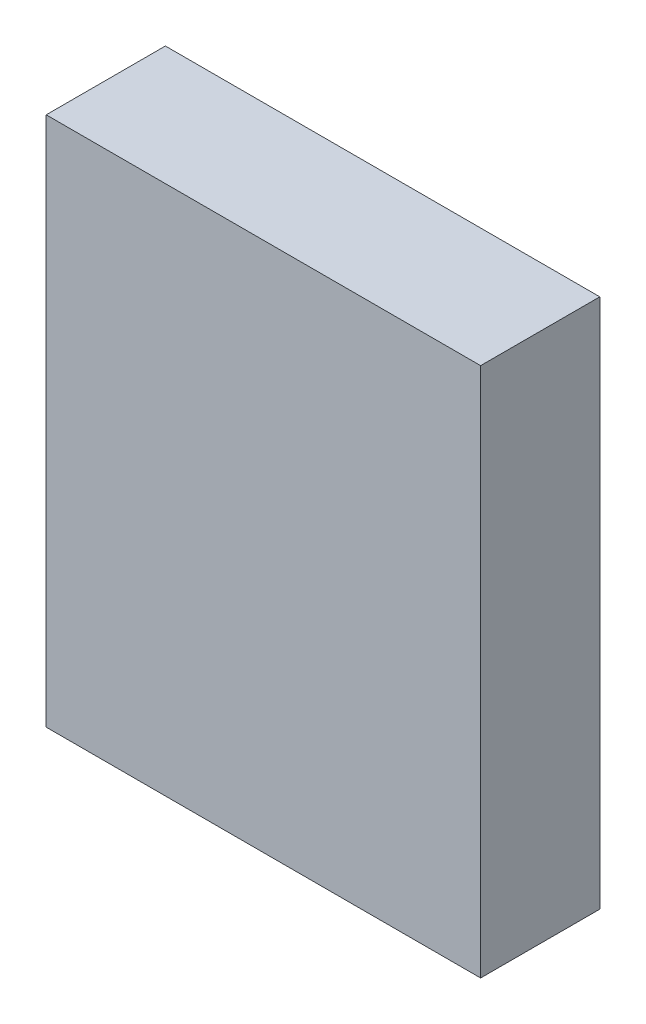
ISO-10303-21;
HEADER;
FILE_DESCRIPTION(('STEP AP214'),'2;1');
FILE_NAME('part.step','',(''),(''),'','','');
FILE_SCHEMA(('AUTOMOTIVE_DESIGN { 1 0 10303 214 1 1 1 1 }'));
ENDSEC;
DATA;
#1=APPLICATION_CONTEXT('core data for automotive mechanical design processes');
#2=APPLICATION_PROTOCOL_DEFINITION('international standard','automotive_design',2000,#1);
#3=PRODUCT_CONTEXT('',#1,'mechanical');
#4=PRODUCT('Part','Part','',(#3));
#5=PRODUCT_RELATED_PRODUCT_CATEGORY('part','',(#4));
#6=PRODUCT_DEFINITION_FORMATION('','',#4);
#7=PRODUCT_DEFINITION_CONTEXT('part definition',#1,'design');
#8=PRODUCT_DEFINITION('design','',#6,#7);
#9=PRODUCT_DEFINITION_SHAPE('','',#8);
#10=(LENGTH_UNIT() NAMED_UNIT(*) SI_UNIT(.MILLI.,.METRE.));
#11=(NAMED_UNIT(*) PLANE_ANGLE_UNIT() SI_UNIT($,.RADIAN.));
#12=(NAMED_UNIT(*) SI_UNIT($,.STERADIAN.) SOLID_ANGLE_UNIT());
#13=UNCERTAINTY_MEASURE_WITH_UNIT(LENGTH_MEASURE(1.E-05),#10,'distance_accuracy_value','');
#14=(GEOMETRIC_REPRESENTATION_CONTEXT(3) GLOBAL_UNCERTAINTY_ASSIGNED_CONTEXT((#13)) GLOBAL_UNIT_ASSIGNED_CONTEXT((#10,
#11,#12)) REPRESENTATION_CONTEXT('',''));
#15=CARTESIAN_POINT('',(0.,0.,0.));
#16=DIRECTION('',(0.,0.,1.));
#17=DIRECTION('',(1.,0.,0.));
#18=AXIS2_PLACEMENT_3D('',#15,#16,#17);
#19=CARTESIAN_POINT('',(206.525,16.17525340094,-37.12183441299));
#20=DIRECTION('',(0.,0.,-1.));
#21=DIRECTION('',(-1.,0.,0.));
#22=AXIS2_PLACEMENT_3D('',#19,#20,#21);
#23=PLANE('',#22);
#24=DIRECTION('',(-1.,9.309009259641E-13,0.));
#25=VECTOR('',#24,1.);
#26=CARTESIAN_POINT('',(206.525,18.58626473742,-37.12183441299));
#27=LINE('',#26,#25);
#28=CARTESIAN_POINT('',(208.5,18.5862647374195,-37.12183441299));
#29=VERTEX_POINT('',#28);
#30=CARTESIAN_POINT('',(204.55,18.5862647374205,-37.12183441299));
#31=VERTEX_POINT('',#30);
#32=EDGE_CURVE('E20',#29,#31,#27,.T.);
#33=ORIENTED_EDGE('',*,*,#32,.F.);
#34=DIRECTION('',(0.,1.,0.));
#35=VECTOR('',#34,1.);
#36=CARTESIAN_POINT('',(208.5,-54.,-37.12183441299));
#37=LINE('',#36,#35);
#38=CARTESIAN_POINT('',(208.5,13.76424206447,-37.12183441299));
#39=VERTEX_POINT('',#38);
#40=EDGE_CURVE('E80',#39,#29,#37,.T.);
#41=ORIENTED_EDGE('',*,*,#40,.F.);
#42=DIRECTION('',(1.,0.,0.));
#43=VECTOR('',#42,1.);
#44=CARTESIAN_POINT('',(206.525,13.76424206447,-37.12183441299));
#45=LINE('',#44,#43);
#46=CARTESIAN_POINT('',(204.55,13.76424206447,-37.12183441299));
#47=VERTEX_POINT('',#46);
#48=EDGE_CURVE('E55',#39,#47,#45,.F.);
#49=ORIENTED_EDGE('',*,*,#48,.T.);
#50=DIRECTION('',(0.,1.,0.));
#51=VECTOR('',#50,1.);
#52=CARTESIAN_POINT('',(204.55,-54.,-37.12183441299));
#53=LINE('',#52,#51);
#54=EDGE_CURVE('E57',#47,#31,#53,.T.);
#55=ORIENTED_EDGE('',*,*,#54,.T.);
#56=EDGE_LOOP('',(#33,#41,#49,#55));
#57=FACE_BOUND('',#56,.T.);
#58=ADVANCED_FACE('F17',(#57),#23,.T.);
#59=CARTESIAN_POINT('',(206.525,18.58626473742,-36.58));
#60=DIRECTION('',(9.309009259641E-13,1.,0.));
#61=DIRECTION('',(-1.,9.309009259641E-13,0.));
#62=AXIS2_PLACEMENT_3D('',#59,#60,#61);
#63=PLANE('',#62);
#64=DIRECTION('',(1.,0.,0.));
#65=VECTOR('',#64,1.);
#66=CARTESIAN_POINT('',(206.525,18.58626473742,-36.03816558701));
#67=LINE('',#66,#65);
#68=CARTESIAN_POINT('',(208.5,18.5862647374191,-36.03816558701));
#69=VERTEX_POINT('',#68);
#70=CARTESIAN_POINT('',(204.55,18.5862647374209,-36.03816558701));
#71=VERTEX_POINT('',#70);
#72=EDGE_CURVE('E83',#69,#71,#67,.F.);
#73=ORIENTED_EDGE('',*,*,#72,.F.);
#74=DIRECTION('',(0.,0.,-1.));
#75=VECTOR('',#74,1.);
#76=CARTESIAN_POINT('',(208.5,18.58626473742,101.5));
#77=LINE('',#76,#75);
#78=EDGE_CURVE('E68',#29,#69,#77,.F.);
#79=ORIENTED_EDGE('',*,*,#78,.F.);
#80=ORIENTED_EDGE('',*,*,#32,.T.);
#81=DIRECTION('',(0.,0.,-1.));
#82=VECTOR('',#81,1.);
#83=CARTESIAN_POINT('',(204.55,18.58626473742,101.5));
#84=LINE('',#83,#82);
#85=EDGE_CURVE('E63',#31,#71,#84,.F.);
#86=ORIENTED_EDGE('',*,*,#85,.T.);
#87=EDGE_LOOP('',(#73,#79,#80,#86));
#88=FACE_BOUND('',#87,.T.);
#89=ADVANCED_FACE('F65',(#88),#63,.T.);
#90=CARTESIAN_POINT('',(204.55,-54.,101.5));
#91=DIRECTION('',(1.,0.,0.));
#92=DIRECTION('',(0.,0.,-1.));
#93=AXIS2_PLACEMENT_3D('',#90,#91,#92);
#94=PLANE('',#93);
#95=ORIENTED_EDGE('',*,*,#54,.F.);
#96=DIRECTION('',(0.,0.,1.));
#97=VECTOR('',#96,1.);
#98=CARTESIAN_POINT('',(204.55,13.76424206447,-36.58));
#99=LINE('',#98,#97);
#100=CARTESIAN_POINT('',(204.55,13.76424206447,-36.03816558701));
#101=VERTEX_POINT('',#100);
#102=EDGE_CURVE('E75',#47,#101,#99,.T.);
#103=ORIENTED_EDGE('',*,*,#102,.T.);
#104=DIRECTION('',(0.,1.,0.));
#105=VECTOR('',#104,1.);
#106=CARTESIAN_POINT('',(204.55,16.17525340094,-36.03816558701));
#107=LINE('',#106,#105);
#108=EDGE_CURVE('E72',#71,#101,#107,.F.);
#109=ORIENTED_EDGE('',*,*,#108,.F.);
#110=ORIENTED_EDGE('',*,*,#85,.F.);
#111=EDGE_LOOP('',(#95,#103,#109,#110));
#112=FACE_BOUND('',#111,.T.);
#113=ADVANCED_FACE('F70',(#112),#94,.F.);
#114=CARTESIAN_POINT('',(206.525,13.76424206447,-36.58));
#115=DIRECTION('',(0.,1.,0.));
#116=DIRECTION('',(0.,0.,1.));
#117=AXIS2_PLACEMENT_3D('',#114,#115,#116);
#118=PLANE('',#117);
#119=ORIENTED_EDGE('',*,*,#102,.F.);
#120=ORIENTED_EDGE('',*,*,#48,.F.);
#121=DIRECTION('',(0.,0.,-1.));
#122=VECTOR('',#121,1.);
#123=CARTESIAN_POINT('',(208.5,13.76424206447,101.5));
#124=LINE('',#123,#122);
#125=CARTESIAN_POINT('',(208.5,13.76424206447,-36.03816558701));
#126=VERTEX_POINT('',#125);
#127=EDGE_CURVE('E35',#126,#39,#124,.T.);
#128=ORIENTED_EDGE('',*,*,#127,.F.);
#129=DIRECTION('',(1.,0.,0.));
#130=VECTOR('',#129,1.);
#131=CARTESIAN_POINT('',(206.525,13.76424206447,-36.03816558701));
#132=LINE('',#131,#130);
#133=EDGE_CURVE('E26',#101,#126,#132,.T.);
#134=ORIENTED_EDGE('',*,*,#133,.F.);
#135=EDGE_LOOP('',(#119,#120,#128,#134));
#136=FACE_BOUND('',#135,.T.);
#137=ADVANCED_FACE('F89',(#136),#118,.F.);
#138=CARTESIAN_POINT('',(208.5,-54.,101.5));
#139=DIRECTION('',(1.,0.,0.));
#140=DIRECTION('',(0.,0.,-1.));
#141=AXIS2_PLACEMENT_3D('',#138,#139,#140);
#142=PLANE('',#141);
#143=ORIENTED_EDGE('',*,*,#78,.T.);
#144=DIRECTION('',(0.,1.,0.));
#145=VECTOR('',#144,1.);
#146=CARTESIAN_POINT('',(208.5,16.17525340094,-36.03816558701));
#147=LINE('',#146,#145);
#148=EDGE_CURVE('E11',#126,#69,#147,.T.);
#149=ORIENTED_EDGE('',*,*,#148,.F.);
#150=ORIENTED_EDGE('',*,*,#127,.T.);
#151=ORIENTED_EDGE('',*,*,#40,.T.);
#152=EDGE_LOOP('',(#143,#149,#150,#151));
#153=FACE_BOUND('',#152,.T.);
#154=ADVANCED_FACE('F91',(#153),#142,.T.);
#155=CARTESIAN_POINT('',(206.525,16.17525340094,-36.03816558701));
#156=DIRECTION('',(0.,0.,1.));
#157=DIRECTION('',(1.,0.,0.));
#158=AXIS2_PLACEMENT_3D('',#155,#156,#157);
#159=PLANE('',#158);
#160=ORIENTED_EDGE('',*,*,#133,.T.);
#161=ORIENTED_EDGE('',*,*,#148,.T.);
#162=ORIENTED_EDGE('',*,*,#72,.T.);
#163=ORIENTED_EDGE('',*,*,#108,.T.);
#164=EDGE_LOOP('',(#160,#161,#162,#163));
#165=FACE_BOUND('',#164,.T.);
#166=ADVANCED_FACE('F88',(#165),#159,.T.);
#167=CLOSED_SHELL('',(#58,#89,#113,#137,#154,#166));
#168=MANIFOLD_SOLID_BREP('B1',#167);
#169=ADVANCED_BREP_SHAPE_REPRESENTATION('',(#18,#168),#14);
#170=SHAPE_DEFINITION_REPRESENTATION(#9,#169);
ENDSEC;
END-ISO-10303-21;
